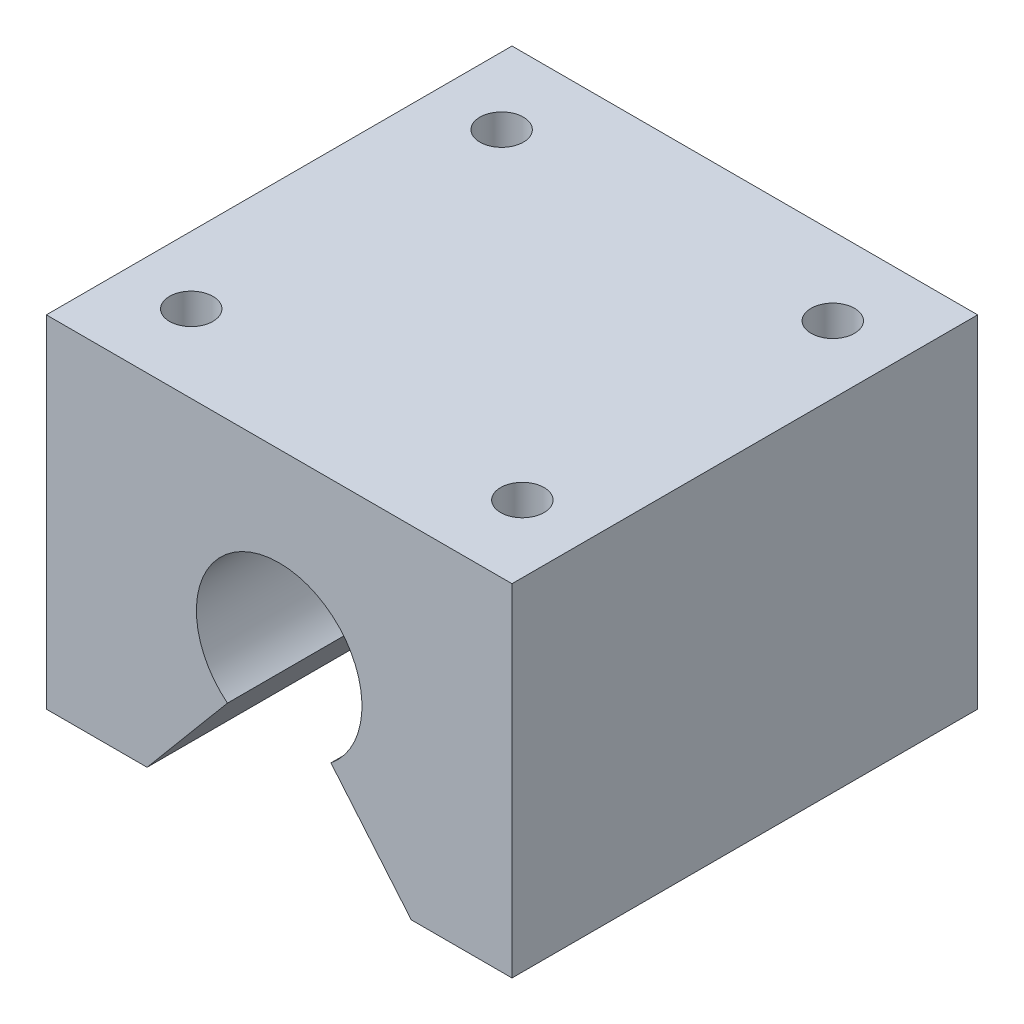
ISO-10303-21;
HEADER;
FILE_DESCRIPTION(('STEP AP214'),'2;1');
FILE_NAME('part.step','',(''),(''),'','','');
FILE_SCHEMA(('AUTOMOTIVE_DESIGN { 1 0 10303 214 1 1 1 1 }'));
ENDSEC;
DATA;
#1=APPLICATION_CONTEXT('core data for automotive mechanical design processes');
#2=APPLICATION_PROTOCOL_DEFINITION('international standard','automotive_design',2000,#1);
#3=PRODUCT_CONTEXT('',#1,'mechanical');
#4=PRODUCT('Part','Part','',(#3));
#5=PRODUCT_RELATED_PRODUCT_CATEGORY('part','',(#4));
#6=PRODUCT_DEFINITION_FORMATION('','',#4);
#7=PRODUCT_DEFINITION_CONTEXT('part definition',#1,'design');
#8=PRODUCT_DEFINITION('design','',#6,#7);
#9=PRODUCT_DEFINITION_SHAPE('','',#8);
#10=(LENGTH_UNIT() NAMED_UNIT(*) SI_UNIT(.MILLI.,.METRE.));
#11=(NAMED_UNIT(*) PLANE_ANGLE_UNIT() SI_UNIT($,.RADIAN.));
#12=(NAMED_UNIT(*) SI_UNIT($,.STERADIAN.) SOLID_ANGLE_UNIT());
#13=UNCERTAINTY_MEASURE_WITH_UNIT(LENGTH_MEASURE(1.E-05),#10,'distance_accuracy_value','');
#14=(GEOMETRIC_REPRESENTATION_CONTEXT(3) GLOBAL_UNCERTAINTY_ASSIGNED_CONTEXT((#13)) GLOBAL_UNIT_ASSIGNED_CONTEXT((#10,
#11,#12)) REPRESENTATION_CONTEXT('',''));
#15=CARTESIAN_POINT('',(0.,0.,0.));
#16=DIRECTION('',(0.,0.,1.));
#17=DIRECTION('',(1.,0.,0.));
#18=AXIS2_PLACEMENT_3D('',#15,#16,#17);
#19=CARTESIAN_POINT('',(-16.,2.945102335044,-15.));
#20=DIRECTION('',(0.,1.,0.));
#21=DIRECTION('',(0.,0.,1.));
#22=AXIS2_PLACEMENT_3D('',#19,#20,#21);
#23=CYLINDRICAL_SURFACE('',#22,2.5);
#24=CARTESIAN_POINT('',(-16.,7.5,-15.));
#25=DIRECTION('',(0.,1.,0.));
#26=DIRECTION('',(0.,0.,1.));
#27=AXIS2_PLACEMENT_3D('',#24,#25,#26);
#28=CIRCLE('',#27,2.5);
#29=CARTESIAN_POINT('',(-16.,7.5,-12.5));
#30=VERTEX_POINT('',#29);
#31=EDGE_CURVE('P0_E11',#30,#30,#28,.T.);
#32=ORIENTED_EDGE('',*,*,#31,.T.);
#33=EDGE_LOOP('',(#32));
#34=FACE_BOUND('',#33,.T.);
#35=CARTESIAN_POINT('',(-16.,17.5,-15.));
#36=DIRECTION('',(0.,1.,0.));
#37=DIRECTION('',(0.,0.,1.));
#38=AXIS2_PLACEMENT_3D('',#35,#36,#37);
#39=CIRCLE('',#38,2.5);
#40=CARTESIAN_POINT('',(-16.,17.5,-12.5));
#41=VERTEX_POINT('',#40);
#42=EDGE_CURVE('P0_E24',#41,#41,#39,.F.);
#43=ORIENTED_EDGE('',*,*,#42,.T.);
#44=EDGE_LOOP('',(#43));
#45=FACE_BOUND('',#44,.T.);
#46=ADVANCED_FACE('P0_F17',(#34,#45),#23,.T.);
#47=CARTESIAN_POINT('',(-16.,7.5,-15.));
#48=DIRECTION('',(0.,1.,0.));
#49=DIRECTION('',(0.,0.,1.));
#50=AXIS2_PLACEMENT_3D('',#47,#48,#49);
#51=PLANE('',#50);
#52=CARTESIAN_POINT('',(-13.9,7.5,-15.));
#53=CARTESIAN_POINT('',(-13.9,7.5,-14.5997062141164));
#54=CARTESIAN_POINT('',(-14.0474445677689,7.5,-14.2270011099201));
#55=CARTESIAN_POINT('',(-14.2072442583811,7.5,-13.8230651681532));
#56=CARTESIAN_POINT('',(-14.5150757595082,7.5,-13.5150757595083));
#57=CARTESIAN_POINT('',(-14.8221622614414,7.5,-13.2078317322177));
#58=CARTESIAN_POINT('',(-15.2270011099201,7.5,-13.0474445677689));
#59=CARTESIAN_POINT('',(-15.5989154034327,7.5,-12.9001012997534));
#60=CARTESIAN_POINT('',(-16.,7.5,-12.9));
#61=CARTESIAN_POINT('',(-16.4000383919048,7.5,-12.8998989644808));
#62=CARTESIAN_POINT('',(-16.7729988900799,7.5,-13.0474445677689));
#63=CARTESIAN_POINT('',(-17.1769348318415,7.5,-13.2072442583757));
#64=CARTESIAN_POINT('',(-17.4849242404918,7.5,-13.5150757595083));
#65=CARTESIAN_POINT('',(-17.7921682677857,7.5,-13.8221622614448));
#66=CARTESIAN_POINT('',(-17.9525554322311,7.5,-14.2270011099201));
#67=CARTESIAN_POINT('',(-18.1,7.5,-14.5991710976863));
#68=CARTESIAN_POINT('',(-18.1,7.5,-15.));
#69=B_SPLINE_CURVE_WITH_KNOTS('',2,(#52,#53,#54,#55,#56,#57,#58,#59,#60,#61,#62,#63,#64,#65,#66,
#67,#68),.UNSPECIFIED.,.F.,.F.,(3,2,2,2,2,2,2,2,3),(0.,0.125,0.25,0.375,0.5,0.625,0.75,0.875,
1.),.UNSPECIFIED.);
#70=CARTESIAN_POINT('',(-13.9,7.5,-15.));
#71=VERTEX_POINT('',#70);
#72=CARTESIAN_POINT('',(-18.1,7.5,-15.));
#73=VERTEX_POINT('',#72);
#74=EDGE_CURVE('P0_E28',#71,#73,#69,.T.);
#75=ORIENTED_EDGE('',*,*,#74,.F.);
#76=CARTESIAN_POINT('',(-18.1,7.5,-15.));
#77=CARTESIAN_POINT('',(-18.1,7.5,-15.4002937858799));
#78=CARTESIAN_POINT('',(-17.9525554322311,7.5,-15.7729988900799));
#79=CARTESIAN_POINT('',(-17.7927557416207,7.5,-16.1769348318465));
#80=CARTESIAN_POINT('',(-17.4849242404918,7.5,-16.4849242404918));
#81=CARTESIAN_POINT('',(-17.1778377385606,7.5,-16.7921682677789));
#82=CARTESIAN_POINT('',(-16.7729988900799,7.5,-16.9525554322311));
#83=CARTESIAN_POINT('',(-16.4010845965701,7.5,-17.0998987002479));
#84=CARTESIAN_POINT('',(-16.,7.5,-17.1));
#85=CARTESIAN_POINT('',(-15.5999616080875,7.5,-17.1001010355179));
#86=CARTESIAN_POINT('',(-15.2270011099201,7.5,-16.9525554322311));
#87=CARTESIAN_POINT('',(-14.823065168153,7.5,-16.7927557416202));
#88=CARTESIAN_POINT('',(-14.5150757595082,7.5,-16.4849242404918));
#89=CARTESIAN_POINT('',(-14.2078317322141,7.5,-16.1778377385536));
#90=CARTESIAN_POINT('',(-14.0474445677689,7.5,-15.7729988900799));
#91=CARTESIAN_POINT('',(-13.9,7.5,-15.4008289023147));
#92=CARTESIAN_POINT('',(-13.9,7.5,-15.));
#93=B_SPLINE_CURVE_WITH_KNOTS('',2,(#76,#77,#78,#79,#80,#81,#82,#83,#84,#85,#86,#87,#88,#89,#90,
#91,#92),.UNSPECIFIED.,.F.,.F.,(3,2,2,2,2,2,2,2,3),(0.,0.125,0.25,0.375,0.5,0.625,0.75,0.875,
1.),.UNSPECIFIED.);
#94=EDGE_CURVE('P0_E33',#73,#71,#93,.T.);
#95=ORIENTED_EDGE('',*,*,#94,.F.);
#96=EDGE_LOOP('',(#75,#95));
#97=FACE_BOUND('',#96,.T.);
#98=ORIENTED_EDGE('',*,*,#31,.F.);
#99=EDGE_LOOP('',(#98));
#100=FACE_BOUND('',#99,.T.);
#101=ADVANCED_FACE('P0_F18',(#97,#100),#51,.F.);
#102=OPEN_SHELL('',(#46,#101));
#103=SHELL_BASED_SURFACE_MODEL('P0_B1',(#102));
#104=CARTESIAN_POINT('',(-22.5,-15.5,-22.5));
#105=DIRECTION('',(0.,-1.,0.));
#106=DIRECTION('',(0.,0.,-1.));
#107=AXIS2_PLACEMENT_3D('',#104,#105,#106);
#108=PLANE('',#107);
#109=DIRECTION('',(0.,0.,1.));
#110=VECTOR('',#109,1.);
#111=CARTESIAN_POINT('',(-22.5,-15.5,-22.5));
#112=LINE('',#111,#110);
#113=CARTESIAN_POINT('',(-22.5,-15.5,-22.5));
#114=VERTEX_POINT('',#113);
#115=CARTESIAN_POINT('',(-22.5,-15.5,22.5));
#116=VERTEX_POINT('',#115);
#117=EDGE_CURVE('P1_E122',#114,#116,#112,.T.);
#118=ORIENTED_EDGE('',*,*,#117,.F.);
#119=DIRECTION('',(1.,0.,0.));
#120=VECTOR('',#119,1.);
#121=CARTESIAN_POINT('',(0.,-15.5,-22.5));
#122=LINE('',#121,#120);
#123=CARTESIAN_POINT('',(-12.76586876609,-15.5,-22.5));
#124=VERTEX_POINT('',#123);
#125=EDGE_CURVE('P1_E156',#114,#124,#122,.T.);
#126=ORIENTED_EDGE('',*,*,#125,.T.);
#127=DIRECTION('',(0.,0.,1.));
#128=VECTOR('',#127,1.);
#129=CARTESIAN_POINT('',(-12.76586876609,-15.5,-22.5));
#130=LINE('',#129,#128);
#131=CARTESIAN_POINT('',(-12.76586876609,-15.5,22.5));
#132=VERTEX_POINT('',#131);
#133=EDGE_CURVE('P1_E151',#132,#124,#130,.F.);
#134=ORIENTED_EDGE('',*,*,#133,.F.);
#135=DIRECTION('',(1.,0.,0.));
#136=VECTOR('',#135,1.);
#137=CARTESIAN_POINT('',(0.,-15.5,22.5));
#138=LINE('',#137,#136);
#139=EDGE_CURVE('P1_E120',#116,#132,#138,.T.);
#140=ORIENTED_EDGE('',*,*,#139,.F.);
#141=EDGE_LOOP('',(#118,#126,#134,#140));
#142=FACE_BOUND('',#141,.T.);
#143=ADVANCED_FACE('P1_F17',(#142),#108,.T.);
#144=CARTESIAN_POINT('',(-12.76586876609,-15.5,-22.5));
#145=DIRECTION('',(0.766044443119007,-0.642787609686505,0.));
#146=DIRECTION('',(0.642787609686505,0.766044443119007,0.));
#147=AXIS2_PLACEMENT_3D('',#144,#145,#146);
#148=PLANE('',#147);
#149=ORIENTED_EDGE('',*,*,#133,.T.);
#150=DIRECTION('',(0.642787609686577,0.766044443118946,0.));
#151=VECTOR('',#150,1.);
#152=CARTESIAN_POINT('',(-12.76586876609,-15.5,-22.5));
#153=LINE('',#152,#151);
#154=CARTESIAN_POINT('',(-5.0000000000002,-6.24499799839824,-22.5));
#155=VERTEX_POINT('',#154);
#156=EDGE_CURVE('P1_E158',#124,#155,#153,.T.);
#157=ORIENTED_EDGE('',*,*,#156,.T.);
#158=DIRECTION('',(0.,0.,1.));
#159=VECTOR('',#158,1.);
#160=CARTESIAN_POINT('',(-5.0000000000002,-6.24499799839824,-22.5));
#161=LINE('',#160,#159);
#162=CARTESIAN_POINT('',(-5.0000000000002,-6.24499799839824,22.5));
#163=VERTEX_POINT('',#162);
#164=EDGE_CURVE('P1_E92',#155,#163,#161,.T.);
#165=ORIENTED_EDGE('',*,*,#164,.T.);
#166=DIRECTION('',(0.642787609686577,0.766044443118946,0.));
#167=VECTOR('',#166,1.);
#168=CARTESIAN_POINT('',(-12.76586876609,-15.5,22.5));
#169=LINE('',#168,#167);
#170=EDGE_CURVE('P1_E119',#132,#163,#169,.T.);
#171=ORIENTED_EDGE('',*,*,#170,.F.);
#172=EDGE_LOOP('',(#149,#157,#165,#171));
#173=FACE_BOUND('',#172,.T.);
#174=ADVANCED_FACE('P1_F229',(#173),#148,.T.);
#175=CARTESIAN_POINT('',(0.,0.,-22.5));
#176=DIRECTION('',(0.,0.,1.));
#177=DIRECTION('',(1.,0.,0.));
#178=AXIS2_PLACEMENT_3D('',#175,#176,#177);
#179=CYLINDRICAL_SURFACE('',#178,8.);
#180=CARTESIAN_POINT('',(0.,0.,22.5));
#181=DIRECTION('',(0.,0.,1.));
#182=DIRECTION('',(1.,0.,0.));
#183=AXIS2_PLACEMENT_3D('',#180,#181,#182);
#184=CIRCLE('',#183,8.);
#185=CARTESIAN_POINT('',(5.0000000000001,-6.24499799839812,22.5));
#186=VERTEX_POINT('',#185);
#187=EDGE_CURVE('P1_E20',#163,#186,#184,.F.);
#188=ORIENTED_EDGE('',*,*,#187,.F.);
#189=ORIENTED_EDGE('',*,*,#164,.F.);
#190=CARTESIAN_POINT('',(0.,0.,-22.5));
#191=DIRECTION('',(0.,0.,1.));
#192=DIRECTION('',(1.,0.,0.));
#193=AXIS2_PLACEMENT_3D('',#190,#191,#192);
#194=CIRCLE('',#193,8.);
#195=CARTESIAN_POINT('',(5.0000000000001,-6.24499799839812,-22.5));
#196=VERTEX_POINT('',#195);
#197=EDGE_CURVE('P1_E103',#155,#196,#194,.F.);
#198=ORIENTED_EDGE('',*,*,#197,.T.);
#199=DIRECTION('',(0.,0.,1.));
#200=VECTOR('',#199,1.);
#201=CARTESIAN_POINT('',(5.,-6.244997998398,-22.5));
#202=LINE('',#201,#200);
#203=EDGE_CURVE('P1_E97',#186,#196,#202,.F.);
#204=ORIENTED_EDGE('',*,*,#203,.F.);
#205=EDGE_LOOP('',(#188,#189,#198,#204));
#206=FACE_BOUND('',#205,.T.);
#207=ADVANCED_FACE('P1_F99',(#206),#179,.F.);
#208=CARTESIAN_POINT('',(5.,-6.244997998398,-22.5));
#209=DIRECTION('',(-0.766044443119007,-0.642787609686505,0.));
#210=DIRECTION('',(0.642787609686505,-0.766044443119007,0.));
#211=AXIS2_PLACEMENT_3D('',#208,#209,#210);
#212=PLANE('',#211);
#213=ORIENTED_EDGE('',*,*,#203,.T.);
#214=DIRECTION('',(0.642787609686577,-0.766044443118946,0.));
#215=VECTOR('',#214,1.);
#216=CARTESIAN_POINT('',(5.,-6.244997998398,-22.5));
#217=LINE('',#216,#215);
#218=CARTESIAN_POINT('',(12.76586876609,-15.5,-22.5));
#219=VERTEX_POINT('',#218);
#220=EDGE_CURVE('P1_E147',#196,#219,#217,.T.);
#221=ORIENTED_EDGE('',*,*,#220,.T.);
#222=DIRECTION('',(0.,0.,-1.));
#223=VECTOR('',#222,1.);
#224=CARTESIAN_POINT('',(12.76586876609,-15.5,-22.5));
#225=LINE('',#224,#223);
#226=CARTESIAN_POINT('',(12.7658687660899,-15.5,22.5));
#227=VERTEX_POINT('',#226);
#228=EDGE_CURVE('P1_E106',#227,#219,#225,.T.);
#229=ORIENTED_EDGE('',*,*,#228,.F.);
#230=DIRECTION('',(0.642787609686577,-0.766044443118946,0.));
#231=VECTOR('',#230,1.);
#232=CARTESIAN_POINT('',(5.,-6.244997998398,22.5));
#233=LINE('',#232,#231);
#234=EDGE_CURVE('P1_E109',#186,#227,#233,.T.);
#235=ORIENTED_EDGE('',*,*,#234,.F.);
#236=EDGE_LOOP('',(#213,#221,#229,#235));
#237=FACE_BOUND('',#236,.T.);
#238=ADVANCED_FACE('P1_F110',(#237),#212,.T.);
#239=CARTESIAN_POINT('',(12.76586876609,-15.5,-22.5));
#240=DIRECTION('',(0.,-1.,0.));
#241=DIRECTION('',(0.,0.,-1.));
#242=AXIS2_PLACEMENT_3D('',#239,#240,#241);
#243=PLANE('',#242);
#244=ORIENTED_EDGE('',*,*,#228,.T.);
#245=DIRECTION('',(1.,0.,0.));
#246=VECTOR('',#245,1.);
#247=CARTESIAN_POINT('',(0.,-15.5,-22.5));
#248=LINE('',#247,#246);
#249=CARTESIAN_POINT('',(22.5,-15.5,-22.5));
#250=VERTEX_POINT('',#249);
#251=EDGE_CURVE('P1_E145',#219,#250,#248,.T.);
#252=ORIENTED_EDGE('',*,*,#251,.T.);
#253=DIRECTION('',(0.,0.,-1.));
#254=VECTOR('',#253,1.);
#255=CARTESIAN_POINT('',(22.5,-15.5,-22.5));
#256=LINE('',#255,#254);
#257=CARTESIAN_POINT('',(22.5,-15.5,22.5));
#258=VERTEX_POINT('',#257);
#259=EDGE_CURVE('P1_E164',#258,#250,#256,.T.);
#260=ORIENTED_EDGE('',*,*,#259,.F.);
#261=DIRECTION('',(1.,0.,0.));
#262=VECTOR('',#261,1.);
#263=CARTESIAN_POINT('',(0.,-15.5,22.5));
#264=LINE('',#263,#262);
#265=EDGE_CURVE('P1_E114',#227,#258,#264,.T.);
#266=ORIENTED_EDGE('',*,*,#265,.F.);
#267=EDGE_LOOP('',(#244,#252,#260,#266));
#268=FACE_BOUND('',#267,.T.);
#269=ADVANCED_FACE('P1_F215',(#268),#243,.T.);
#270=CARTESIAN_POINT('',(-16.,4.90000000002055,15.));
#271=DIRECTION('',(0.,1.,0.));
#272=DIRECTION('',(0.,0.,1.));
#273=AXIS2_PLACEMENT_3D('',#270,#271,#272);
#274=CONICAL_SURFACE('',#273,2.10000000002174,1.0297442586027);
#275=CARTESIAN_POINT('',(-15.9999999998774,3.63819270000931,15.));
#276=VERTEX_POINT('',#275);
#277=VERTEX_LOOP('',#276);
#278=FACE_BOUND('',#277,.T.);
#279=CARTESIAN_POINT('',(-16.,4.9,15.));
#280=DIRECTION('',(0.,1.,0.));
#281=DIRECTION('',(0.,0.,1.));
#282=AXIS2_PLACEMENT_3D('',#279,#280,#281);
#283=CIRCLE('',#282,2.1);
#284=CARTESIAN_POINT('',(-16.,4.9,17.1));
#285=VERTEX_POINT('',#284);
#286=EDGE_CURVE('P1_E139',#285,#285,#283,.T.);
#287=ORIENTED_EDGE('',*,*,#286,.T.);
#288=EDGE_LOOP('',(#287));
#289=FACE_BOUND('',#288,.T.);
#290=ADVANCED_FACE('P1_F279',(#278,#289),#274,.F.);
#291=CARTESIAN_POINT('',(16.,4.89999999996371,15.));
#292=DIRECTION('',(0.,1.,0.));
#293=DIRECTION('',(0.,0.,1.));
#294=AXIS2_PLACEMENT_3D('',#291,#292,#293);
#295=CONICAL_SURFACE('',#294,2.09999999994716,1.02974425855146);
#296=CARTESIAN_POINT('',(16.0000000001332,3.63819269992405,15.));
#297=VERTEX_POINT('',#296);
#298=VERTEX_LOOP('',#297);
#299=FACE_BOUND('',#298,.T.);
#300=CARTESIAN_POINT('',(16.,4.9,15.));
#301=DIRECTION('',(0.,1.,0.));
#302=DIRECTION('',(0.,0.,1.));
#303=AXIS2_PLACEMENT_3D('',#300,#301,#302);
#304=CIRCLE('',#303,2.1);
#305=CARTESIAN_POINT('',(16.,4.9,17.1));
#306=VERTEX_POINT('',#305);
#307=EDGE_CURVE('P1_E136',#306,#306,#304,.T.);
#308=ORIENTED_EDGE('',*,*,#307,.T.);
#309=EDGE_LOOP('',(#308));
#310=FACE_BOUND('',#309,.T.);
#311=ADVANCED_FACE('P1_F275',(#299,#310),#295,.F.);
#312=CARTESIAN_POINT('',(-16.,4.90000000002055,-15.));
#313=DIRECTION('',(0.,1.,0.));
#314=DIRECTION('',(0.,0.,1.));
#315=AXIS2_PLACEMENT_3D('',#312,#313,#314);
#316=CONICAL_SURFACE('',#315,2.10000000002174,1.0297442586027);
#317=CARTESIAN_POINT('',(-15.9999999998774,3.63819270000931,-15.));
#318=VERTEX_POINT('',#317);
#319=VERTEX_LOOP('',#318);
#320=FACE_BOUND('',#319,.T.);
#321=CARTESIAN_POINT('',(-16.,4.9,-15.));
#322=DIRECTION('',(0.,1.,0.));
#323=DIRECTION('',(0.,0.,1.));
#324=AXIS2_PLACEMENT_3D('',#321,#322,#323);
#325=CIRCLE('',#324,2.1);
#326=CARTESIAN_POINT('',(-16.,4.9,-12.9));
#327=VERTEX_POINT('',#326);
#328=EDGE_CURVE('P1_E133',#327,#327,#325,.T.);
#329=ORIENTED_EDGE('',*,*,#328,.T.);
#330=EDGE_LOOP('',(#329));
#331=FACE_BOUND('',#330,.T.);
#332=ADVANCED_FACE('P1_F271',(#320,#331),#316,.F.);
#333=CARTESIAN_POINT('',(16.,4.89999999996371,-15.));
#334=DIRECTION('',(0.,1.,0.));
#335=DIRECTION('',(0.,0.,1.));
#336=AXIS2_PLACEMENT_3D('',#333,#334,#335);
#337=CONICAL_SURFACE('',#336,2.09999999994716,1.02974425855146);
#338=CARTESIAN_POINT('',(16.0000000001332,3.63819269992405,-15.));
#339=VERTEX_POINT('',#338);
#340=VERTEX_LOOP('',#339);
#341=FACE_BOUND('',#340,.T.);
#342=CARTESIAN_POINT('',(16.,4.9,-15.));
#343=DIRECTION('',(0.,1.,0.));
#344=DIRECTION('',(0.,0.,1.));
#345=AXIS2_PLACEMENT_3D('',#342,#343,#344);
#346=CIRCLE('',#345,2.1);
#347=CARTESIAN_POINT('',(16.,4.9,-12.9));
#348=VERTEX_POINT('',#347);
#349=EDGE_CURVE('P1_E129',#348,#348,#346,.T.);
#350=ORIENTED_EDGE('',*,*,#349,.T.);
#351=EDGE_LOOP('',(#350));
#352=FACE_BOUND('',#351,.T.);
#353=ADVANCED_FACE('P1_F268',(#341,#352),#337,.F.);
#354=CARTESIAN_POINT('',(-22.5,17.5,-22.5));
#355=DIRECTION('',(-1.,0.,0.));
#356=DIRECTION('',(0.,0.,1.));
#357=AXIS2_PLACEMENT_3D('',#354,#355,#356);
#358=PLANE('',#357);
#359=DIRECTION('',(0.,0.,1.));
#360=VECTOR('',#359,1.);
#361=CARTESIAN_POINT('',(-22.5,17.5,-22.5));
#362=LINE('',#361,#360);
#363=CARTESIAN_POINT('',(-22.5,17.5,-22.5));
#364=VERTEX_POINT('',#363);
#365=CARTESIAN_POINT('',(-22.5,17.5,22.5));
#366=VERTEX_POINT('',#365);
#367=EDGE_CURVE('P1_E132',#364,#366,#362,.T.);
#368=ORIENTED_EDGE('',*,*,#367,.F.);
#369=DIRECTION('',(0.,1.,0.));
#370=VECTOR('',#369,1.);
#371=CARTESIAN_POINT('',(-22.5,0.,-22.5));
#372=LINE('',#371,#370);
#373=EDGE_CURVE('P1_E159',#364,#114,#372,.F.);
#374=ORIENTED_EDGE('',*,*,#373,.T.);
#375=ORIENTED_EDGE('',*,*,#117,.T.);
#376=DIRECTION('',(0.,1.,0.));
#377=VECTOR('',#376,1.);
#378=CARTESIAN_POINT('',(-22.5,0.,22.5));
#379=LINE('',#378,#377);
#380=EDGE_CURVE('P1_E184',#366,#116,#379,.F.);
#381=ORIENTED_EDGE('',*,*,#380,.F.);
#382=EDGE_LOOP('',(#368,#374,#375,#381));
#383=FACE_BOUND('',#382,.T.);
#384=ADVANCED_FACE('P1_F226',(#383),#358,.T.);
#385=CARTESIAN_POINT('',(0.,0.,22.5));
#386=DIRECTION('',(0.,0.,1.));
#387=DIRECTION('',(1.,0.,0.));
#388=AXIS2_PLACEMENT_3D('',#385,#386,#387);
#389=PLANE('',#388);
#390=DIRECTION('',(1.,0.,0.));
#391=VECTOR('',#390,1.);
#392=CARTESIAN_POINT('',(22.5,17.5,22.5));
#393=LINE('',#392,#391);
#394=CARTESIAN_POINT('',(22.5,17.5,22.5));
#395=VERTEX_POINT('',#394);
#396=EDGE_CURVE('P1_E173',#366,#395,#393,.T.);
#397=ORIENTED_EDGE('',*,*,#396,.F.);
#398=ORIENTED_EDGE('',*,*,#380,.T.);
#399=ORIENTED_EDGE('',*,*,#139,.T.);
#400=ORIENTED_EDGE('',*,*,#170,.T.);
#401=ORIENTED_EDGE('',*,*,#187,.T.);
#402=ORIENTED_EDGE('',*,*,#234,.T.);
#403=ORIENTED_EDGE('',*,*,#265,.T.);
#404=DIRECTION('',(0.,1.,0.));
#405=VECTOR('',#404,1.);
#406=CARTESIAN_POINT('',(22.5,-15.5,22.5));
#407=LINE('',#406,#405);
#408=EDGE_CURVE('P1_E191',#395,#258,#407,.F.);
#409=ORIENTED_EDGE('',*,*,#408,.F.);
#410=EDGE_LOOP('',(#397,#398,#399,#400,#401,#402,#403,#409));
#411=FACE_BOUND('',#410,.T.);
#412=ADVANCED_FACE('P1_F117',(#411),#389,.T.);
#413=CARTESIAN_POINT('',(22.5,-15.5,-22.5));
#414=DIRECTION('',(1.,0.,0.));
#415=DIRECTION('',(0.,0.,-1.));
#416=AXIS2_PLACEMENT_3D('',#413,#414,#415);
#417=PLANE('',#416);
#418=ORIENTED_EDGE('',*,*,#259,.T.);
#419=DIRECTION('',(0.,1.,0.));
#420=VECTOR('',#419,1.);
#421=CARTESIAN_POINT('',(22.5,0.,-22.5));
#422=LINE('',#421,#420);
#423=CARTESIAN_POINT('',(22.5,17.5,-22.5));
#424=VERTEX_POINT('',#423);
#425=EDGE_CURVE('P1_E35',#250,#424,#422,.T.);
#426=ORIENTED_EDGE('',*,*,#425,.T.);
#427=DIRECTION('',(0.,0.,1.));
#428=VECTOR('',#427,1.);
#429=CARTESIAN_POINT('',(22.5,17.5,-22.5));
#430=LINE('',#429,#428);
#431=EDGE_CURVE('P1_E180',#395,#424,#430,.F.);
#432=ORIENTED_EDGE('',*,*,#431,.F.);
#433=ORIENTED_EDGE('',*,*,#408,.T.);
#434=EDGE_LOOP('',(#418,#426,#432,#433));
#435=FACE_BOUND('',#434,.T.);
#436=ADVANCED_FACE('P1_F210',(#435),#417,.T.);
#437=CARTESIAN_POINT('',(0.,0.,-22.5));
#438=DIRECTION('',(0.,0.,1.));
#439=DIRECTION('',(1.,0.,0.));
#440=AXIS2_PLACEMENT_3D('',#437,#438,#439);
#441=PLANE('',#440);
#442=ORIENTED_EDGE('',*,*,#425,.F.);
#443=ORIENTED_EDGE('',*,*,#251,.F.);
#444=ORIENTED_EDGE('',*,*,#220,.F.);
#445=ORIENTED_EDGE('',*,*,#197,.F.);
#446=ORIENTED_EDGE('',*,*,#156,.F.);
#447=ORIENTED_EDGE('',*,*,#125,.F.);
#448=ORIENTED_EDGE('',*,*,#373,.F.);
#449=DIRECTION('',(1.,0.,0.));
#450=VECTOR('',#449,1.);
#451=CARTESIAN_POINT('',(22.5,17.5,-22.5));
#452=LINE('',#451,#450);
#453=EDGE_CURVE('P1_E176',#424,#364,#452,.F.);
#454=ORIENTED_EDGE('',*,*,#453,.F.);
#455=EDGE_LOOP('',(#442,#443,#444,#445,#446,#447,#448,#454));
#456=FACE_BOUND('',#455,.T.);
#457=ADVANCED_FACE('P1_F218',(#456),#441,.F.);
#458=CARTESIAN_POINT('',(-16.,2.945102335044,15.));
#459=DIRECTION('',(0.,1.,0.));
#460=DIRECTION('',(0.,0.,1.));
#461=AXIS2_PLACEMENT_3D('',#458,#459,#460);
#462=CYLINDRICAL_SURFACE('',#461,2.1);
#463=ORIENTED_EDGE('',*,*,#286,.F.);
#464=EDGE_LOOP('',(#463));
#465=FACE_BOUND('',#464,.T.);
#466=CARTESIAN_POINT('',(-16.,17.5,15.));
#467=DIRECTION('',(0.,1.,0.));
#468=DIRECTION('',(0.,0.,1.));
#469=AXIS2_PLACEMENT_3D('',#466,#467,#468);
#470=CIRCLE('',#469,2.1);
#471=CARTESIAN_POINT('',(-16.,17.5,17.1));
#472=VERTEX_POINT('',#471);
#473=EDGE_CURVE('P1_E179',#472,#472,#470,.F.);
#474=ORIENTED_EDGE('',*,*,#473,.F.);
#475=EDGE_LOOP('',(#474));
#476=FACE_BOUND('',#475,.T.);
#477=ADVANCED_FACE('P1_F255',(#465,#476),#462,.F.);
#478=CARTESIAN_POINT('',(16.,2.945102335044,15.));
#479=DIRECTION('',(0.,1.,0.));
#480=DIRECTION('',(0.,0.,1.));
#481=AXIS2_PLACEMENT_3D('',#478,#479,#480);
#482=CYLINDRICAL_SURFACE('',#481,2.1);
#483=ORIENTED_EDGE('',*,*,#307,.F.);
#484=EDGE_LOOP('',(#483));
#485=FACE_BOUND('',#484,.T.);
#486=CARTESIAN_POINT('',(16.,17.5,15.));
#487=DIRECTION('',(0.,1.,0.));
#488=DIRECTION('',(0.,0.,1.));
#489=AXIS2_PLACEMENT_3D('',#486,#487,#488);
#490=CIRCLE('',#489,2.1);
#491=CARTESIAN_POINT('',(16.,17.5,17.1));
#492=VERTEX_POINT('',#491);
#493=EDGE_CURVE('P1_E196',#492,#492,#490,.F.);
#494=ORIENTED_EDGE('',*,*,#493,.F.);
#495=EDGE_LOOP('',(#494));
#496=FACE_BOUND('',#495,.T.);
#497=ADVANCED_FACE('P1_F251',(#485,#496),#482,.F.);
#498=CARTESIAN_POINT('',(-16.,2.945102335044,-15.));
#499=DIRECTION('',(0.,1.,0.));
#500=DIRECTION('',(0.,0.,1.));
#501=AXIS2_PLACEMENT_3D('',#498,#499,#500);
#502=CYLINDRICAL_SURFACE('',#501,2.1);
#503=ORIENTED_EDGE('',*,*,#328,.F.);
#504=EDGE_LOOP('',(#503));
#505=FACE_BOUND('',#504,.T.);
#506=CARTESIAN_POINT('',(-16.,17.5,-15.));
#507=DIRECTION('',(0.,1.,0.));
#508=DIRECTION('',(0.,0.,1.));
#509=AXIS2_PLACEMENT_3D('',#506,#507,#508);
#510=CIRCLE('',#509,2.1);
#511=CARTESIAN_POINT('',(-16.,17.5,-12.9));
#512=VERTEX_POINT('',#511);
#513=EDGE_CURVE('P1_E26',#512,#512,#510,.F.);
#514=ORIENTED_EDGE('',*,*,#513,.F.);
#515=EDGE_LOOP('',(#514));
#516=FACE_BOUND('',#515,.T.);
#517=ADVANCED_FACE('P1_F244',(#505,#516),#502,.F.);
#518=CARTESIAN_POINT('',(16.,2.945102335044,-15.));
#519=DIRECTION('',(0.,1.,0.));
#520=DIRECTION('',(0.,0.,1.));
#521=AXIS2_PLACEMENT_3D('',#518,#519,#520);
#522=CYLINDRICAL_SURFACE('',#521,2.1);
#523=ORIENTED_EDGE('',*,*,#349,.F.);
#524=EDGE_LOOP('',(#523));
#525=FACE_BOUND('',#524,.T.);
#526=CARTESIAN_POINT('',(16.,17.5,-15.));
#527=DIRECTION('',(0.,1.,0.));
#528=DIRECTION('',(0.,0.,1.));
#529=AXIS2_PLACEMENT_3D('',#526,#527,#528);
#530=CIRCLE('',#529,2.1);
#531=CARTESIAN_POINT('',(16.,17.5,-12.9));
#532=VERTEX_POINT('',#531);
#533=EDGE_CURVE('P1_E11',#532,#532,#530,.F.);
#534=ORIENTED_EDGE('',*,*,#533,.F.);
#535=EDGE_LOOP('',(#534));
#536=FACE_BOUND('',#535,.T.);
#537=ADVANCED_FACE('P1_F238',(#525,#536),#522,.F.);
#538=CARTESIAN_POINT('',(22.5,17.5,-22.5));
#539=DIRECTION('',(0.,1.,0.));
#540=DIRECTION('',(0.,0.,1.));
#541=AXIS2_PLACEMENT_3D('',#538,#539,#540);
#542=PLANE('',#541);
#543=ORIENTED_EDGE('',*,*,#533,.T.);
#544=EDGE_LOOP('',(#543));
#545=FACE_BOUND('',#544,.T.);
#546=ORIENTED_EDGE('',*,*,#513,.T.);
#547=EDGE_LOOP('',(#546));
#548=FACE_BOUND('',#547,.T.);
#549=ORIENTED_EDGE('',*,*,#493,.T.);
#550=EDGE_LOOP('',(#549));
#551=FACE_BOUND('',#550,.T.);
#552=ORIENTED_EDGE('',*,*,#473,.T.);
#553=EDGE_LOOP('',(#552));
#554=FACE_BOUND('',#553,.T.);
#555=ORIENTED_EDGE('',*,*,#431,.T.);
#556=ORIENTED_EDGE('',*,*,#453,.T.);
#557=ORIENTED_EDGE('',*,*,#367,.T.);
#558=ORIENTED_EDGE('',*,*,#396,.T.);
#559=EDGE_LOOP('',(#555,#556,#557,#558));
#560=FACE_BOUND('',#559,.T.);
#561=ADVANCED_FACE('P1_F224',(#545,#548,#551,#554,#560),#542,.T.);
#562=CLOSED_SHELL('',(#143,#174,#207,#238,#269,#290,#311,#332,#353,#384,#412,#436,#457,#477,
#497,#517,#537,#561));
#563=MANIFOLD_SOLID_BREP('P1_B1',#562);
#564=CARTESIAN_POINT('',(16.,2.945102335044,15.));
#565=DIRECTION('',(0.,1.,0.));
#566=DIRECTION('',(0.,0.,1.));
#567=AXIS2_PLACEMENT_3D('',#564,#565,#566);
#568=CYLINDRICAL_SURFACE('',#567,2.5);
#569=CARTESIAN_POINT('',(16.,7.5,15.));
#570=DIRECTION('',(0.,1.,0.));
#571=DIRECTION('',(0.,0.,1.));
#572=AXIS2_PLACEMENT_3D('',#569,#570,#571);
#573=CIRCLE('',#572,2.5);
#574=CARTESIAN_POINT('',(16.,7.5,17.5));
#575=VERTEX_POINT('',#574);
#576=EDGE_CURVE('P2_E11',#575,#575,#573,.T.);
#577=ORIENTED_EDGE('',*,*,#576,.T.);
#578=EDGE_LOOP('',(#577));
#579=FACE_BOUND('',#578,.T.);
#580=CARTESIAN_POINT('',(16.,17.5,15.));
#581=DIRECTION('',(0.,1.,0.));
#582=DIRECTION('',(0.,0.,1.));
#583=AXIS2_PLACEMENT_3D('',#580,#581,#582);
#584=CIRCLE('',#583,2.5);
#585=CARTESIAN_POINT('',(16.,17.5,17.5));
#586=VERTEX_POINT('',#585);
#587=EDGE_CURVE('P2_E24',#586,#586,#584,.F.);
#588=ORIENTED_EDGE('',*,*,#587,.T.);
#589=EDGE_LOOP('',(#588));
#590=FACE_BOUND('',#589,.T.);
#591=ADVANCED_FACE('P2_F17',(#579,#590),#568,.T.);
#592=CARTESIAN_POINT('',(16.,7.5,15.));
#593=DIRECTION('',(0.,1.,0.));
#594=DIRECTION('',(0.,0.,1.));
#595=AXIS2_PLACEMENT_3D('',#592,#593,#594);
#596=PLANE('',#595);
#597=CARTESIAN_POINT('',(18.1,7.5,15.));
#598=CARTESIAN_POINT('',(18.1,7.5,15.4002937858799));
#599=CARTESIAN_POINT('',(17.9525554322311,7.5,15.7729988900799));
#600=CARTESIAN_POINT('',(17.7927557416207,7.5,16.1769348318465));
#601=CARTESIAN_POINT('',(17.4849242404918,7.5,16.4849242404918));
#602=CARTESIAN_POINT('',(17.1778377385606,7.5,16.7921682677789));
#603=CARTESIAN_POINT('',(16.7729988900799,7.5,16.9525554322311));
#604=CARTESIAN_POINT('',(16.4010845965701,7.5,17.0998987002479));
#605=CARTESIAN_POINT('',(16.,7.5,17.1));
#606=CARTESIAN_POINT('',(15.5999616080875,7.5,17.1001010355179));
#607=CARTESIAN_POINT('',(15.2270011099201,7.5,16.9525554322311));
#608=CARTESIAN_POINT('',(14.823065168153,7.5,16.7927557416202));
#609=CARTESIAN_POINT('',(14.5150757595082,7.5,16.4849242404918));
#610=CARTESIAN_POINT('',(14.2078317322141,7.5,16.1778377385536));
#611=CARTESIAN_POINT('',(14.0474445677689,7.5,15.7729988900799));
#612=CARTESIAN_POINT('',(13.9,7.5,15.4008289023147));
#613=CARTESIAN_POINT('',(13.9,7.5,15.));
#614=B_SPLINE_CURVE_WITH_KNOTS('',2,(#597,#598,#599,#600,#601,#602,#603,#604,#605,#606,#607,
#608,#609,#610,#611,#612,#613),.UNSPECIFIED.,.F.,.F.,(3,2,2,2,2,2,2,2,3),(0.,0.125,0.25,0.375,
0.5,0.625,0.75,0.875,1.),.UNSPECIFIED.);
#615=CARTESIAN_POINT('',(18.1,7.5,15.));
#616=VERTEX_POINT('',#615);
#617=CARTESIAN_POINT('',(13.9,7.5,15.));
#618=VERTEX_POINT('',#617);
#619=EDGE_CURVE('P2_E28',#616,#618,#614,.T.);
#620=ORIENTED_EDGE('',*,*,#619,.F.);
#621=CARTESIAN_POINT('',(13.9,7.5,15.));
#622=CARTESIAN_POINT('',(13.9,7.5,14.5997062141164));
#623=CARTESIAN_POINT('',(14.0474445677689,7.5,14.2270011099201));
#624=CARTESIAN_POINT('',(14.2072442583811,7.5,13.8230651681532));
#625=CARTESIAN_POINT('',(14.5150757595082,7.5,13.5150757595083));
#626=CARTESIAN_POINT('',(14.8221622614414,7.5,13.2078317322177));
#627=CARTESIAN_POINT('',(15.2270011099201,7.5,13.0474445677689));
#628=CARTESIAN_POINT('',(15.5989154034327,7.5,12.9001012997534));
#629=CARTESIAN_POINT('',(16.,7.5,12.9));
#630=CARTESIAN_POINT('',(16.4000383919048,7.5,12.8998989644808));
#631=CARTESIAN_POINT('',(16.7729988900799,7.5,13.0474445677689));
#632=CARTESIAN_POINT('',(17.1769348318415,7.5,13.2072442583757));
#633=CARTESIAN_POINT('',(17.4849242404918,7.5,13.5150757595083));
#634=CARTESIAN_POINT('',(17.7921682677857,7.5,13.8221622614448));
#635=CARTESIAN_POINT('',(17.9525554322311,7.5,14.2270011099201));
#636=CARTESIAN_POINT('',(18.1,7.5,14.5991710976863));
#637=CARTESIAN_POINT('',(18.1,7.5,15.));
#638=B_SPLINE_CURVE_WITH_KNOTS('',2,(#621,#622,#623,#624,#625,#626,#627,#628,#629,#630,#631,
#632,#633,#634,#635,#636,#637),.UNSPECIFIED.,.F.,.F.,(3,2,2,2,2,2,2,2,3),(0.,0.125,0.25,0.375,
0.5,0.625,0.75,0.875,1.),.UNSPECIFIED.);
#639=EDGE_CURVE('P2_E33',#618,#616,#638,.T.);
#640=ORIENTED_EDGE('',*,*,#639,.F.);
#641=EDGE_LOOP('',(#620,#640));
#642=FACE_BOUND('',#641,.T.);
#643=ORIENTED_EDGE('',*,*,#576,.F.);
#644=EDGE_LOOP('',(#643));
#645=FACE_BOUND('',#644,.T.);
#646=ADVANCED_FACE('P2_F18',(#642,#645),#596,.F.);
#647=OPEN_SHELL('',(#591,#646));
#648=SHELL_BASED_SURFACE_MODEL('P2_B1',(#647));
#649=CARTESIAN_POINT('',(-16.,2.945102335044,15.));
#650=DIRECTION('',(0.,1.,0.));
#651=DIRECTION('',(0.,0.,1.));
#652=AXIS2_PLACEMENT_3D('',#649,#650,#651);
#653=CYLINDRICAL_SURFACE('',#652,2.5);
#654=CARTESIAN_POINT('',(-16.,7.5,15.));
#655=DIRECTION('',(0.,1.,0.));
#656=DIRECTION('',(0.,0.,1.));
#657=AXIS2_PLACEMENT_3D('',#654,#655,#656);
#658=CIRCLE('',#657,2.5);
#659=CARTESIAN_POINT('',(-16.,7.5,17.5));
#660=VERTEX_POINT('',#659);
#661=EDGE_CURVE('P3_E11',#660,#660,#658,.T.);
#662=ORIENTED_EDGE('',*,*,#661,.T.);
#663=EDGE_LOOP('',(#662));
#664=FACE_BOUND('',#663,.T.);
#665=CARTESIAN_POINT('',(-16.,17.5,15.));
#666=DIRECTION('',(0.,1.,0.));
#667=DIRECTION('',(0.,0.,1.));
#668=AXIS2_PLACEMENT_3D('',#665,#666,#667);
#669=CIRCLE('',#668,2.5);
#670=CARTESIAN_POINT('',(-16.,17.5,17.5));
#671=VERTEX_POINT('',#670);
#672=EDGE_CURVE('P3_E24',#671,#671,#669,.F.);
#673=ORIENTED_EDGE('',*,*,#672,.T.);
#674=EDGE_LOOP('',(#673));
#675=FACE_BOUND('',#674,.T.);
#676=ADVANCED_FACE('P3_F17',(#664,#675),#653,.T.);
#677=CARTESIAN_POINT('',(-16.,7.5,15.));
#678=DIRECTION('',(0.,1.,0.));
#679=DIRECTION('',(0.,0.,1.));
#680=AXIS2_PLACEMENT_3D('',#677,#678,#679);
#681=PLANE('',#680);
#682=CARTESIAN_POINT('',(-13.9,7.5,15.));
#683=CARTESIAN_POINT('',(-13.9,7.5,15.4002937858816));
#684=CARTESIAN_POINT('',(-14.0474445677689,7.5,15.7729988900799));
#685=CARTESIAN_POINT('',(-14.207244258381,7.5,16.1769348318489));
#686=CARTESIAN_POINT('',(-14.5150757595082,7.5,16.4849242404918));
#687=CARTESIAN_POINT('',(-14.8221622614425,7.5,16.7921682677813));
#688=CARTESIAN_POINT('',(-15.2270011099201,7.5,16.9525554322311));
#689=CARTESIAN_POINT('',(-15.5989154034326,7.5,17.0998987002479));
#690=CARTESIAN_POINT('',(-16.,7.5,17.1));
#691=CARTESIAN_POINT('',(-16.4000383919098,7.5,17.1001010355179));
#692=CARTESIAN_POINT('',(-16.7729988900799,7.5,16.9525554322311));
#693=CARTESIAN_POINT('',(-17.1769348318427,7.5,16.7927557416231));
#694=CARTESIAN_POINT('',(-17.4849242404918,7.5,16.4849242404918));
#695=CARTESIAN_POINT('',(-17.7921682677838,7.5,16.1778377385571));
#696=CARTESIAN_POINT('',(-17.9525554322311,7.5,15.7729988900799));
#697=CARTESIAN_POINT('',(-18.1,7.5,15.4008289023164));
#698=CARTESIAN_POINT('',(-18.1,7.5,15.));
#699=B_SPLINE_CURVE_WITH_KNOTS('',2,(#682,#683,#684,#685,#686,#687,#688,#689,#690,#691,#692,
#693,#694,#695,#696,#697,#698),.UNSPECIFIED.,.F.,.F.,(3,2,2,2,2,2,2,2,3),(0.,0.125,0.25,0.375,
0.5,0.625,0.75,0.875,1.),.UNSPECIFIED.);
#700=CARTESIAN_POINT('',(-13.9,7.5,15.));
#701=VERTEX_POINT('',#700);
#702=CARTESIAN_POINT('',(-18.1,7.5,15.));
#703=VERTEX_POINT('',#702);
#704=EDGE_CURVE('P3_E28',#701,#703,#699,.T.);
#705=ORIENTED_EDGE('',*,*,#704,.F.);
#706=CARTESIAN_POINT('',(-18.1,7.5,15.));
#707=CARTESIAN_POINT('',(-18.1,7.5,14.5997062141181));
#708=CARTESIAN_POINT('',(-17.9525554322311,7.5,14.2270011099201));
#709=CARTESIAN_POINT('',(-17.7927557416206,7.5,13.8230651681555));
#710=CARTESIAN_POINT('',(-17.4849242404918,7.5,13.5150757595083));
#711=CARTESIAN_POINT('',(-17.1778377385617,7.5,13.20783173222));
#712=CARTESIAN_POINT('',(-16.7729988900799,7.5,13.0474445677689));
#713=CARTESIAN_POINT('',(-16.40108459657,7.5,12.9001012997534));
#714=CARTESIAN_POINT('',(-16.,7.5,12.9));
#715=CARTESIAN_POINT('',(-15.5999616080926,7.5,12.8998989644808));
#716=CARTESIAN_POINT('',(-15.2270011099201,7.5,13.0474445677689));
#717=CARTESIAN_POINT('',(-14.8230651681542,7.5,13.2072442583786));
#718=CARTESIAN_POINT('',(-14.5150757595082,7.5,13.5150757595083));
#719=CARTESIAN_POINT('',(-14.2078317322122,7.5,13.8221622614483));
#720=CARTESIAN_POINT('',(-14.0474445677689,7.5,14.2270011099201));
#721=CARTESIAN_POINT('',(-13.9,7.5,14.599171097688));
#722=CARTESIAN_POINT('',(-13.9,7.5,15.));
#723=B_SPLINE_CURVE_WITH_KNOTS('',2,(#706,#707,#708,#709,#710,#711,#712,#713,#714,#715,#716,
#717,#718,#719,#720,#721,#722),.UNSPECIFIED.,.F.,.F.,(3,2,2,2,2,2,2,2,3),(0.,0.125,0.25,0.375,
0.5,0.625,0.75,0.875,1.),.UNSPECIFIED.);
#724=EDGE_CURVE('P3_E33',#703,#701,#723,.T.);
#725=ORIENTED_EDGE('',*,*,#724,.F.);
#726=EDGE_LOOP('',(#705,#725));
#727=FACE_BOUND('',#726,.T.);
#728=ORIENTED_EDGE('',*,*,#661,.F.);
#729=EDGE_LOOP('',(#728));
#730=FACE_BOUND('',#729,.T.);
#731=ADVANCED_FACE('P3_F18',(#727,#730),#681,.F.);
#732=OPEN_SHELL('',(#676,#731));
#733=SHELL_BASED_SURFACE_MODEL('P3_B1',(#732));
#734=CARTESIAN_POINT('',(16.,2.945102335044,-15.));
#735=DIRECTION('',(0.,1.,0.));
#736=DIRECTION('',(0.,0.,1.));
#737=AXIS2_PLACEMENT_3D('',#734,#735,#736);
#738=CYLINDRICAL_SURFACE('',#737,2.5);
#739=CARTESIAN_POINT('',(16.,7.5,-15.));
#740=DIRECTION('',(0.,1.,0.));
#741=DIRECTION('',(0.,0.,1.));
#742=AXIS2_PLACEMENT_3D('',#739,#740,#741);
#743=CIRCLE('',#742,2.5);
#744=CARTESIAN_POINT('',(16.,7.5,-12.5));
#745=VERTEX_POINT('',#744);
#746=EDGE_CURVE('P4_E11',#745,#745,#743,.T.);
#747=ORIENTED_EDGE('',*,*,#746,.T.);
#748=EDGE_LOOP('',(#747));
#749=FACE_BOUND('',#748,.T.);
#750=CARTESIAN_POINT('',(16.,17.5,-15.));
#751=DIRECTION('',(0.,1.,0.));
#752=DIRECTION('',(0.,0.,1.));
#753=AXIS2_PLACEMENT_3D('',#750,#751,#752);
#754=CIRCLE('',#753,2.5);
#755=CARTESIAN_POINT('',(16.,17.5,-12.5));
#756=VERTEX_POINT('',#755);
#757=EDGE_CURVE('P4_E24',#756,#756,#754,.F.);
#758=ORIENTED_EDGE('',*,*,#757,.T.);
#759=EDGE_LOOP('',(#758));
#760=FACE_BOUND('',#759,.T.);
#761=ADVANCED_FACE('P4_F17',(#749,#760),#738,.T.);
#762=CARTESIAN_POINT('',(16.,7.5,-15.));
#763=DIRECTION('',(0.,1.,0.));
#764=DIRECTION('',(0.,0.,1.));
#765=AXIS2_PLACEMENT_3D('',#762,#763,#764);
#766=PLANE('',#765);
#767=CARTESIAN_POINT('',(18.1,7.5,-15.));
#768=CARTESIAN_POINT('',(18.1,7.5,-14.5997062141181));
#769=CARTESIAN_POINT('',(17.9525554322311,7.5,-14.2270011099201));
#770=CARTESIAN_POINT('',(17.7927557416206,7.5,-13.8230651681555));
#771=CARTESIAN_POINT('',(17.4849242404918,7.5,-13.5150757595083));
#772=CARTESIAN_POINT('',(17.1778377385617,7.5,-13.20783173222));
#773=CARTESIAN_POINT('',(16.7729988900799,7.5,-13.0474445677689));
#774=CARTESIAN_POINT('',(16.40108459657,7.5,-12.9001012997534));
#775=CARTESIAN_POINT('',(16.,7.5,-12.9));
#776=CARTESIAN_POINT('',(15.5999616080926,7.5,-12.8998989644808));
#777=CARTESIAN_POINT('',(15.2270011099201,7.5,-13.0474445677689));
#778=CARTESIAN_POINT('',(14.8230651681542,7.5,-13.2072442583786));
#779=CARTESIAN_POINT('',(14.5150757595082,7.5,-13.5150757595083));
#780=CARTESIAN_POINT('',(14.2078317322122,7.5,-13.8221622614483));
#781=CARTESIAN_POINT('',(14.0474445677689,7.5,-14.2270011099201));
#782=CARTESIAN_POINT('',(13.9,7.5,-14.599171097688));
#783=CARTESIAN_POINT('',(13.9,7.5,-15.));
#784=B_SPLINE_CURVE_WITH_KNOTS('',2,(#767,#768,#769,#770,#771,#772,#773,#774,#775,#776,#777,
#778,#779,#780,#781,#782,#783),.UNSPECIFIED.,.F.,.F.,(3,2,2,2,2,2,2,2,3),(0.,0.125,0.25,0.375,
0.5,0.625,0.75,0.875,1.),.UNSPECIFIED.);
#785=CARTESIAN_POINT('',(18.1,7.5,-15.));
#786=VERTEX_POINT('',#785);
#787=CARTESIAN_POINT('',(13.9,7.5,-15.));
#788=VERTEX_POINT('',#787);
#789=EDGE_CURVE('P4_E28',#786,#788,#784,.T.);
#790=ORIENTED_EDGE('',*,*,#789,.F.);
#791=CARTESIAN_POINT('',(13.9,7.5,-15.));
#792=CARTESIAN_POINT('',(13.9,7.5,-15.4002937858816));
#793=CARTESIAN_POINT('',(14.0474445677689,7.5,-15.7729988900799));
#794=CARTESIAN_POINT('',(14.207244258381,7.5,-16.1769348318489));
#795=CARTESIAN_POINT('',(14.5150757595082,7.5,-16.4849242404918));
#796=CARTESIAN_POINT('',(14.8221622614425,7.5,-16.7921682677813));
#797=CARTESIAN_POINT('',(15.2270011099201,7.5,-16.9525554322311));
#798=CARTESIAN_POINT('',(15.5989154034326,7.5,-17.0998987002479));
#799=CARTESIAN_POINT('',(16.,7.5,-17.1));
#800=CARTESIAN_POINT('',(16.4000383919098,7.5,-17.1001010355179));
#801=CARTESIAN_POINT('',(16.7729988900799,7.5,-16.9525554322311));
#802=CARTESIAN_POINT('',(17.1769348318427,7.5,-16.7927557416231));
#803=CARTESIAN_POINT('',(17.4849242404918,7.5,-16.4849242404918));
#804=CARTESIAN_POINT('',(17.7921682677838,7.5,-16.1778377385571));
#805=CARTESIAN_POINT('',(17.9525554322311,7.5,-15.7729988900799));
#806=CARTESIAN_POINT('',(18.1,7.5,-15.4008289023164));
#807=CARTESIAN_POINT('',(18.1,7.5,-15.));
#808=B_SPLINE_CURVE_WITH_KNOTS('',2,(#791,#792,#793,#794,#795,#796,#797,#798,#799,#800,#801,
#802,#803,#804,#805,#806,#807),.UNSPECIFIED.,.F.,.F.,(3,2,2,2,2,2,2,2,3),(0.,0.125,0.25,0.375,
0.5,0.625,0.75,0.875,1.),.UNSPECIFIED.);
#809=EDGE_CURVE('P4_E33',#788,#786,#808,.T.);
#810=ORIENTED_EDGE('',*,*,#809,.F.);
#811=EDGE_LOOP('',(#790,#810));
#812=FACE_BOUND('',#811,.T.);
#813=ORIENTED_EDGE('',*,*,#746,.F.);
#814=EDGE_LOOP('',(#813));
#815=FACE_BOUND('',#814,.T.);
#816=ADVANCED_FACE('P4_F18',(#812,#815),#766,.F.);
#817=OPEN_SHELL('',(#761,#816));
#818=SHELL_BASED_SURFACE_MODEL('P4_B1',(#817));
#819=ADVANCED_BREP_SHAPE_REPRESENTATION('',(#18,#563),#14);
#820=MANIFOLD_SURFACE_SHAPE_REPRESENTATION('',(#18,#103,#648,#733,#818),#14);
#821=SHAPE_REPRESENTATION('',(#18),#14);
#822=SHAPE_DEFINITION_REPRESENTATION(#9,#821);
#823=SHAPE_REPRESENTATION_RELATIONSHIP('','',#821,#819);
#824=SHAPE_REPRESENTATION_RELATIONSHIP('','',#821,#820);
ENDSEC;
END-ISO-10303-21;
